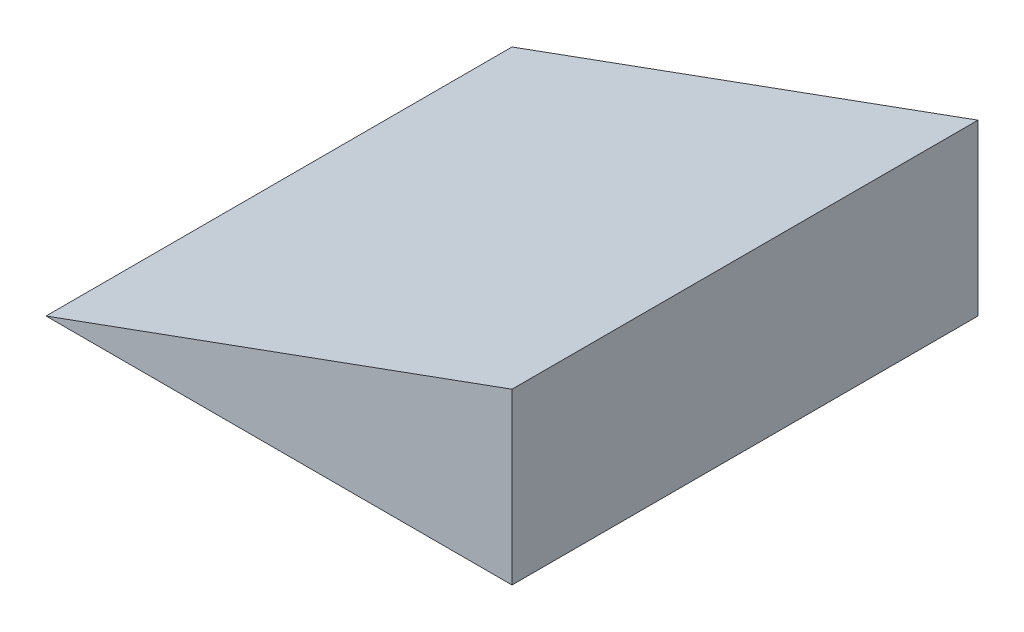
ISO-10303-21;
HEADER;
FILE_DESCRIPTION(('STEP AP214'),'2;1');
FILE_NAME('part.step','',(''),(''),'','','');
FILE_SCHEMA(('AUTOMOTIVE_DESIGN { 1 0 10303 214 1 1 1 1 }'));
ENDSEC;
DATA;
#1=APPLICATION_CONTEXT('core data for automotive mechanical design processes');
#2=APPLICATION_PROTOCOL_DEFINITION('international standard','automotive_design',2000,#1);
#3=PRODUCT_CONTEXT('',#1,'mechanical');
#4=PRODUCT('Part','Part','',(#3));
#5=PRODUCT_RELATED_PRODUCT_CATEGORY('part','',(#4));
#6=PRODUCT_DEFINITION_FORMATION('','',#4);
#7=PRODUCT_DEFINITION_CONTEXT('part definition',#1,'design');
#8=PRODUCT_DEFINITION('design','',#6,#7);
#9=PRODUCT_DEFINITION_SHAPE('','',#8);
#10=(LENGTH_UNIT() NAMED_UNIT(*) SI_UNIT(.MILLI.,.METRE.));
#11=(NAMED_UNIT(*) PLANE_ANGLE_UNIT() SI_UNIT($,.RADIAN.));
#12=(NAMED_UNIT(*) SI_UNIT($,.STERADIAN.) SOLID_ANGLE_UNIT());
#13=UNCERTAINTY_MEASURE_WITH_UNIT(LENGTH_MEASURE(1.E-05),#10,'distance_accuracy_value','');
#14=(GEOMETRIC_REPRESENTATION_CONTEXT(3) GLOBAL_UNCERTAINTY_ASSIGNED_CONTEXT((#13)) GLOBAL_UNIT_ASSIGNED_CONTEXT((#10,
#11,#12)) REPRESENTATION_CONTEXT('',''));
#15=CARTESIAN_POINT('',(0.,0.,0.));
#16=DIRECTION('',(0.,0.,1.));
#17=DIRECTION('',(1.,0.,0.));
#18=AXIS2_PLACEMENT_3D('',#15,#16,#17);
#19=CARTESIAN_POINT('',(2000.,1455.88093706481,4000.));
#20=DIRECTION('',(-1.,0.,0.));
#21=DIRECTION('',(0.,-1.,0.));
#22=AXIS2_PLACEMENT_3D('',#19,#20,#21);
#23=PLANE('',#22);
#24=DIRECTION('',(0.,1.,0.));
#25=VECTOR('',#24,1.);
#26=CARTESIAN_POINT('',(2000.,1455.88093706481,0.));
#27=LINE('',#26,#25);
#28=CARTESIAN_POINT('',(2000.,7.34788079488412E-13,0.));
#29=VERTEX_POINT('',#28);
#30=CARTESIAN_POINT('',(2000.,1455.88093706481,0.));
#31=VERTEX_POINT('',#30);
#32=EDGE_CURVE('E89',#29,#31,#27,.T.);
#33=ORIENTED_EDGE('',*,*,#32,.T.);
#34=DIRECTION('',(0.,0.,-1.));
#35=VECTOR('',#34,1.);
#36=CARTESIAN_POINT('',(2000.,1455.88093706481,4000.));
#37=LINE('',#36,#35);
#38=CARTESIAN_POINT('',(2000.,1455.88093706481,4000.));
#39=VERTEX_POINT('',#38);
#40=EDGE_CURVE('E11',#39,#31,#37,.T.);
#41=ORIENTED_EDGE('',*,*,#40,.F.);
#42=DIRECTION('',(0.,1.,0.));
#43=VECTOR('',#42,1.);
#44=CARTESIAN_POINT('',(2000.,1455.88093706481,4000.));
#45=LINE('',#44,#43);
#46=CARTESIAN_POINT('',(2000.,7.34788079488412E-13,4000.));
#47=VERTEX_POINT('',#46);
#48=EDGE_CURVE('E81',#47,#39,#45,.T.);
#49=ORIENTED_EDGE('',*,*,#48,.F.);
#50=DIRECTION('',(0.,0.,-1.));
#51=VECTOR('',#50,1.);
#52=CARTESIAN_POINT('',(2000.,7.34788079488412E-13,4000.));
#53=LINE('',#52,#51);
#54=EDGE_CURVE('E90',#47,#29,#53,.T.);
#55=ORIENTED_EDGE('',*,*,#54,.T.);
#56=EDGE_LOOP('',(#33,#41,#49,#55));
#57=FACE_BOUND('',#56,.T.);
#58=ADVANCED_FACE('F39',(#57),#23,.F.);
#59=CARTESIAN_POINT('',(-2000.,0.,4000.));
#60=DIRECTION('',(0.34202014332567,-0.939692620785908,0.));
#61=DIRECTION('',(0.939692620785908,0.34202014332567,0.));
#62=AXIS2_PLACEMENT_3D('',#59,#60,#61);
#63=PLANE('',#62);
#64=DIRECTION('',(-0.939692620785908,-0.34202014332567,0.));
#65=VECTOR('',#64,1.);
#66=CARTESIAN_POINT('',(-2000.,0.,0.));
#67=LINE('',#66,#65);
#68=CARTESIAN_POINT('',(-2000.,0.,0.));
#69=VERTEX_POINT('',#68);
#70=EDGE_CURVE('E68',#31,#69,#67,.T.);
#71=ORIENTED_EDGE('',*,*,#70,.T.);
#72=DIRECTION('',(0.,0.,-1.));
#73=VECTOR('',#72,1.);
#74=CARTESIAN_POINT('',(-2000.,0.,4000.));
#75=LINE('',#74,#73);
#76=CARTESIAN_POINT('',(-2000.,0.,4000.));
#77=VERTEX_POINT('',#76);
#78=EDGE_CURVE('E48',#77,#69,#75,.T.);
#79=ORIENTED_EDGE('',*,*,#78,.F.);
#80=DIRECTION('',(-0.939692620785908,-0.34202014332567,0.));
#81=VECTOR('',#80,1.);
#82=CARTESIAN_POINT('',(-2000.,0.,4000.));
#83=LINE('',#82,#81);
#84=EDGE_CURVE('E76',#39,#77,#83,.T.);
#85=ORIENTED_EDGE('',*,*,#84,.F.);
#86=ORIENTED_EDGE('',*,*,#40,.T.);
#87=EDGE_LOOP('',(#71,#79,#85,#86));
#88=FACE_BOUND('',#87,.T.);
#89=ADVANCED_FACE('F77',(#88),#63,.F.);
#90=CARTESIAN_POINT('',(-2000.,0.,4000.));
#91=DIRECTION('',(0.,1.,0.));
#92=DIRECTION('',(-1.,0.,0.));
#93=AXIS2_PLACEMENT_3D('',#90,#91,#92);
#94=PLANE('',#93);
#95=DIRECTION('',(1.,0.,0.));
#96=VECTOR('',#95,1.);
#97=CARTESIAN_POINT('',(-2000.,0.,0.));
#98=LINE('',#97,#96);
#99=EDGE_CURVE('E73',#69,#29,#98,.T.);
#100=ORIENTED_EDGE('',*,*,#99,.T.);
#101=ORIENTED_EDGE('',*,*,#54,.F.);
#102=DIRECTION('',(1.,0.,0.));
#103=VECTOR('',#102,1.);
#104=CARTESIAN_POINT('',(-2000.,0.,4000.));
#105=LINE('',#104,#103);
#106=EDGE_CURVE('E56',#77,#47,#105,.T.);
#107=ORIENTED_EDGE('',*,*,#106,.F.);
#108=ORIENTED_EDGE('',*,*,#78,.T.);
#109=EDGE_LOOP('',(#100,#101,#107,#108));
#110=FACE_BOUND('',#109,.T.);
#111=ADVANCED_FACE('F102',(#110),#94,.F.);
#112=CARTESIAN_POINT('',(0.,0.,4000.));
#113=DIRECTION('',(0.,0.,1.));
#114=DIRECTION('',(1.,0.,0.));
#115=AXIS2_PLACEMENT_3D('',#112,#113,#114);
#116=PLANE('',#115);
#117=ORIENTED_EDGE('',*,*,#48,.T.);
#118=ORIENTED_EDGE('',*,*,#84,.T.);
#119=ORIENTED_EDGE('',*,*,#106,.T.);
#120=EDGE_LOOP('',(#117,#118,#119));
#121=FACE_BOUND('',#120,.T.);
#122=ADVANCED_FACE('F84',(#121),#116,.T.);
#123=CARTESIAN_POINT('',(0.,0.,0.));
#124=DIRECTION('',(0.,0.,1.));
#125=DIRECTION('',(1.,0.,0.));
#126=AXIS2_PLACEMENT_3D('',#123,#124,#125);
#127=PLANE('',#126);
#128=ORIENTED_EDGE('',*,*,#32,.F.);
#129=ORIENTED_EDGE('',*,*,#99,.F.);
#130=ORIENTED_EDGE('',*,*,#70,.F.);
#131=EDGE_LOOP('',(#128,#129,#130));
#132=FACE_BOUND('',#131,.T.);
#133=ADVANCED_FACE('F103',(#132),#127,.F.);
#134=CLOSED_SHELL('',(#58,#89,#111,#122,#133));
#135=MANIFOLD_SOLID_BREP('B2',#134);
#136=ADVANCED_BREP_SHAPE_REPRESENTATION('',(#18,#135),#14);
#137=SHAPE_DEFINITION_REPRESENTATION(#9,#136);
ENDSEC;
END-ISO-10303-21;
